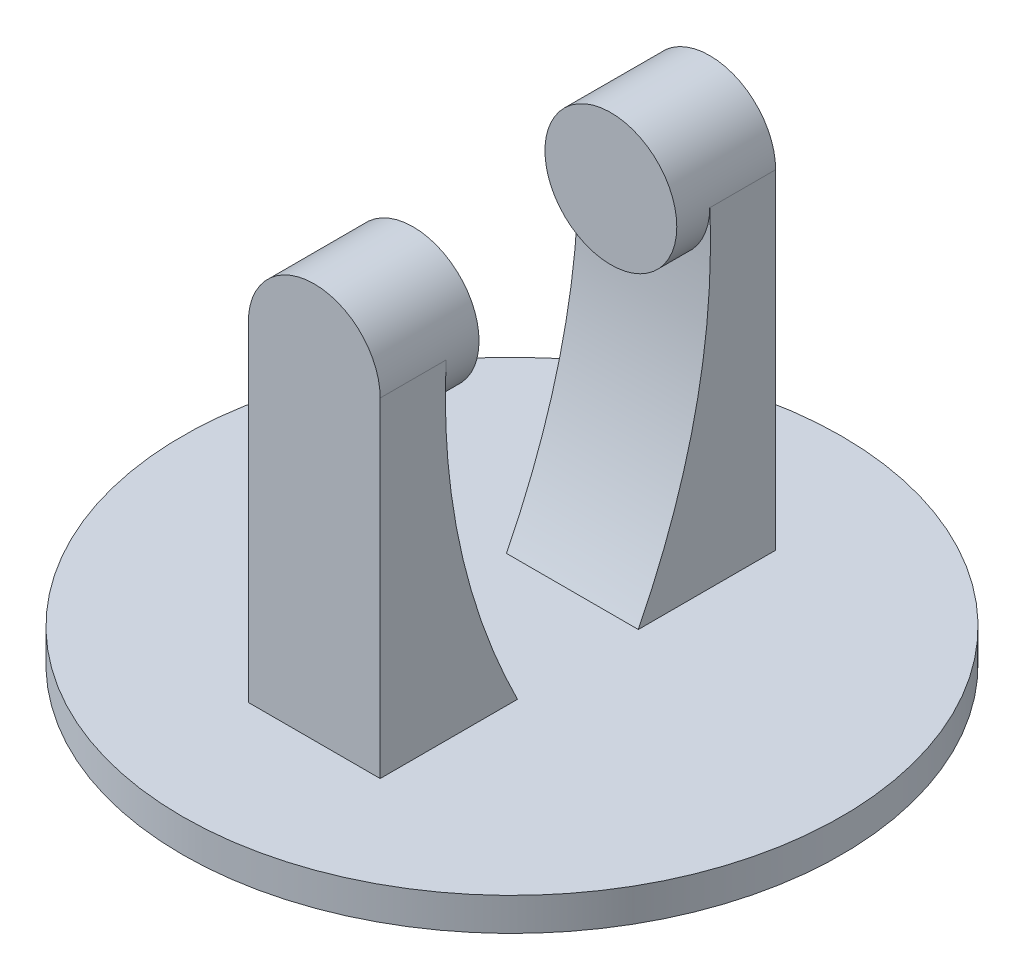
ISO-10303-21;
HEADER;
FILE_DESCRIPTION(('STEP AP214'),'2;1');
FILE_NAME('part.step','',(''),(''),'','','');
FILE_SCHEMA(('AUTOMOTIVE_DESIGN { 1 0 10303 214 1 1 1 1 }'));
ENDSEC;
DATA;
#1=APPLICATION_CONTEXT('core data for automotive mechanical design processes');
#2=APPLICATION_PROTOCOL_DEFINITION('international standard','automotive_design',2000,#1);
#3=PRODUCT_CONTEXT('',#1,'mechanical');
#4=PRODUCT('Part','Part','',(#3));
#5=PRODUCT_RELATED_PRODUCT_CATEGORY('part','',(#4));
#6=PRODUCT_DEFINITION_FORMATION('','',#4);
#7=PRODUCT_DEFINITION_CONTEXT('part definition',#1,'design');
#8=PRODUCT_DEFINITION('design','',#6,#7);
#9=PRODUCT_DEFINITION_SHAPE('','',#8);
#10=(LENGTH_UNIT() NAMED_UNIT(*) SI_UNIT(.MILLI.,.METRE.));
#11=(NAMED_UNIT(*) PLANE_ANGLE_UNIT() SI_UNIT($,.RADIAN.));
#12=(NAMED_UNIT(*) SI_UNIT($,.STERADIAN.) SOLID_ANGLE_UNIT());
#13=UNCERTAINTY_MEASURE_WITH_UNIT(LENGTH_MEASURE(1.E-05),#10,'distance_accuracy_value','');
#14=(GEOMETRIC_REPRESENTATION_CONTEXT(3) GLOBAL_UNCERTAINTY_ASSIGNED_CONTEXT((#13)) GLOBAL_UNIT_ASSIGNED_CONTEXT((#10,
#11,#12)) REPRESENTATION_CONTEXT('',''));
#15=CARTESIAN_POINT('',(0.,0.,0.));
#16=DIRECTION('',(0.,0.,1.));
#17=DIRECTION('',(1.,0.,0.));
#18=AXIS2_PLACEMENT_3D('',#15,#16,#17);
#19=CARTESIAN_POINT('',(71.,5.00000000000001,-9.16621620997291));
#20=CARTESIAN_POINT('',(71.,29.1291286348068,-21.2181294552747));
#21=CARTESIAN_POINT('',(71.,55.,-20.));
#22=B_SPLINE_CURVE_WITH_KNOTS('',2,(#19,#20,#21),.UNSPECIFIED.,.F.,.F.,(3,3),(0.,1.),.UNSPECIFIED.);
#23=DIRECTION('',(-1.,0.,0.));
#24=VECTOR('',#23,1.);
#25=SURFACE_OF_LINEAR_EXTRUSION('',#22,#24);
#26=DIRECTION('',(-1.,0.,0.));
#27=VECTOR('',#26,1.);
#28=CARTESIAN_POINT('',(71.,5.00000000000001,-9.16621620997291));
#29=LINE('',#28,#27);
#30=CARTESIAN_POINT('',(10.,5.,-9.16621620997291));
#31=VERTEX_POINT('',#30);
#32=CARTESIAN_POINT('',(-9.99999999999999,5.00000000000001,-9.16621620997291));
#33=VERTEX_POINT('',#32);
#34=EDGE_CURVE('E143',#31,#33,#29,.T.);
#35=ORIENTED_EDGE('',*,*,#34,.F.);
#36=CARTESIAN_POINT('',(10.,5.00000000000001,-9.16621620997291));
#37=CARTESIAN_POINT('',(10.,29.1291286348068,-21.2181294552747));
#38=CARTESIAN_POINT('',(10.,55.,-20.));
#39=B_SPLINE_CURVE_WITH_KNOTS('',2,(#36,#37,#38),.UNSPECIFIED.,.F.,.F.,(3,3),(0.,1.),.UNSPECIFIED.);
#40=CARTESIAN_POINT('',(10.,55.,-20.));
#41=VERTEX_POINT('',#40);
#42=EDGE_CURVE('E140',#41,#31,#39,.F.);
#43=ORIENTED_EDGE('',*,*,#42,.F.);
#44=DIRECTION('',(-1.,0.,0.));
#45=VECTOR('',#44,1.);
#46=CARTESIAN_POINT('',(71.,55.,-20.));
#47=LINE('',#46,#45);
#48=CARTESIAN_POINT('',(-10.,55.,-20.));
#49=VERTEX_POINT('',#48);
#50=EDGE_CURVE('E126',#41,#49,#47,.T.);
#51=ORIENTED_EDGE('',*,*,#50,.T.);
#52=CARTESIAN_POINT('',(-9.99999999999999,5.00000000000001,-9.16621620997291));
#53=CARTESIAN_POINT('',(-9.99999999999999,29.1291286348068,-21.2181294552747));
#54=CARTESIAN_POINT('',(-9.99999999999999,55.,-20.));
#55=B_SPLINE_CURVE_WITH_KNOTS('',2,(#52,#53,#54),.UNSPECIFIED.,.F.,.F.,(3,3),(0.,1.),.UNSPECIFIED.);
#56=EDGE_CURVE('E137',#33,#49,#55,.T.);
#57=ORIENTED_EDGE('',*,*,#56,.F.);
#58=EDGE_LOOP('',(#35,#43,#51,#57));
#59=FACE_BOUND('',#58,.T.);
#60=DIRECTION('',(-1.,0.,0.));
#61=VECTOR('',#60,1.);
#62=CARTESIAN_POINT('',(0.,45.5593940625961,-20.));
#63=LINE('',#62,#61);
#64=CARTESIAN_POINT('',(-3.29772035422255,45.5593940625961,-20.));
#65=VERTEX_POINT('',#64);
#66=CARTESIAN_POINT('',(3.29772035422255,45.5593940625961,-20.));
#67=VERTEX_POINT('',#66);
#68=EDGE_CURVE('E11',#65,#67,#63,.F.);
#69=ORIENTED_EDGE('',*,*,#68,.T.);
#70=CARTESIAN_POINT('',(3.29772035422244,45.559394062596,-20.));
#71=CARTESIAN_POINT('',(3.02892611762223,45.4654664598282,-19.9955136859434));
#72=CARTESIAN_POINT('',(2.75609427585658,45.3830773511503,-19.9914584820888));
#73=CARTESIAN_POINT('',(2.2044076591064,45.2418505050547,-19.9843733362315));
#74=CARTESIAN_POINT('',(1.92555329109727,45.1830111814635,-19.98134332518));
#75=CARTESIAN_POINT('',(1.37156719804575,45.0906344882697,-19.9765380091939));
#76=CARTESIAN_POINT('',(1.09654425142486,45.0564453042907,-19.9747304662435));
#77=CARTESIAN_POINT('',(0.544615740513268,45.0110035824606,-19.972319843286));
#78=CARTESIAN_POINT('',(0.267710265484324,44.9997499646051,-19.971716706565));
#79=CARTESIAN_POINT('',(-0.284591828833632,45.0002571050911,-19.9717437747347));
#80=CARTESIAN_POINT('',(-0.5599885695491,45.0118946627654,-19.9723673772968));
#81=CARTESIAN_POINT('',(-1.10888647517297,45.0578555624295,-19.9748050178421));
#82=CARTESIAN_POINT('',(-1.38238756798224,45.092179762551,-19.9766191008559));
#83=CARTESIAN_POINT('',(-1.93326503477183,45.1845723993028,-19.981423743917));
#84=CARTESIAN_POINT('',(-2.21053377183331,45.2432820325005,-19.984445984055));
#85=CARTESIAN_POINT('',(-2.75910636570185,45.3839877280837,-19.9915033855504));
#86=CARTESIAN_POINT('',(-3.03040978043423,45.4659855100695,-19.995538621705));
#87=CARTESIAN_POINT('',(-3.29772035422246,45.559394062596,-20.));
#88=B_SPLINE_CURVE_WITH_KNOTS('',3,(#70,#71,#72,#73,#74,#75,#76,#77,#78,#79,#80,#81,#82,#83,#84,
#85,#86,#87),.UNSPECIFIED.,.F.,.F.,(4,2,2,2,2,2,2,2,4),(0.,0.854045129624884,1.70803272616397,
2.53851600667453,3.36896017996676,4.19494711753831,5.02096530019915,5.87023572725006,
6.71956888085777),.UNSPECIFIED.);
#89=EDGE_CURVE('E324',#67,#65,#88,.T.);
#90=ORIENTED_EDGE('',*,*,#89,.T.);
#91=EDGE_LOOP('',(#69,#90));
#92=FACE_BOUND('',#91,.T.);
#93=ADVANCED_FACE('F46',(#59,#92),#25,.T.);
#94=CARTESIAN_POINT('',(71.,55.,20.));
#95=CARTESIAN_POINT('',(71.,29.1291286348069,21.2181294552747));
#96=CARTESIAN_POINT('',(71.,5.00000000000001,9.16621620997289));
#97=B_SPLINE_CURVE_WITH_KNOTS('',2,(#94,#95,#96),.UNSPECIFIED.,.F.,.F.,(3,3),(0.,1.),.UNSPECIFIED.);
#98=DIRECTION('',(-1.,0.,0.));
#99=VECTOR('',#98,1.);
#100=SURFACE_OF_LINEAR_EXTRUSION('',#97,#99);
#101=DIRECTION('',(-1.,0.,0.));
#102=VECTOR('',#101,1.);
#103=CARTESIAN_POINT('',(71.,55.,20.));
#104=LINE('',#103,#102);
#105=CARTESIAN_POINT('',(10.,55.,20.));
#106=VERTEX_POINT('',#105);
#107=CARTESIAN_POINT('',(-10.,55.,20.));
#108=VERTEX_POINT('',#107);
#109=EDGE_CURVE('E157',#106,#108,#104,.T.);
#110=ORIENTED_EDGE('',*,*,#109,.F.);
#111=CARTESIAN_POINT('',(10.,55.,20.));
#112=CARTESIAN_POINT('',(10.,29.1291286348069,21.2181294552747));
#113=CARTESIAN_POINT('',(10.,5.00000000000001,9.16621620997289));
#114=B_SPLINE_CURVE_WITH_KNOTS('',2,(#111,#112,#113),.UNSPECIFIED.,.F.,.F.,(3,3),(0.,1.),.UNSPECIFIED.);
#115=CARTESIAN_POINT('',(10.,5.,9.16621620997289));
#116=VERTEX_POINT('',#115);
#117=EDGE_CURVE('E199',#116,#106,#114,.F.);
#118=ORIENTED_EDGE('',*,*,#117,.F.);
#119=DIRECTION('',(-1.,0.,0.));
#120=VECTOR('',#119,1.);
#121=CARTESIAN_POINT('',(71.,5.,9.16621620997289));
#122=LINE('',#121,#120);
#123=CARTESIAN_POINT('',(-9.99999999999999,5.,9.16621620997289));
#124=VERTEX_POINT('',#123);
#125=EDGE_CURVE('E248',#116,#124,#122,.T.);
#126=ORIENTED_EDGE('',*,*,#125,.T.);
#127=CARTESIAN_POINT('',(-9.99999999999999,55.,20.));
#128=CARTESIAN_POINT('',(-9.99999999999999,29.1291286348069,21.2181294552747));
#129=CARTESIAN_POINT('',(-9.99999999999999,5.00000000000001,9.16621620997289));
#130=B_SPLINE_CURVE_WITH_KNOTS('',2,(#127,#128,#129),.UNSPECIFIED.,.F.,.F.,(3,3),(0.,1.),.UNSPECIFIED.);
#131=EDGE_CURVE('E156',#108,#124,#130,.T.);
#132=ORIENTED_EDGE('',*,*,#131,.F.);
#133=EDGE_LOOP('',(#110,#118,#126,#132));
#134=FACE_BOUND('',#133,.T.);
#135=DIRECTION('',(-1.,0.,0.));
#136=VECTOR('',#135,1.);
#137=CARTESIAN_POINT('',(0.,45.5593940625955,20.));
#138=LINE('',#137,#136);
#139=CARTESIAN_POINT('',(3.297720354221,45.5593940625955,20.));
#140=VERTEX_POINT('',#139);
#141=CARTESIAN_POINT('',(-3.297720354221,45.5593940625955,20.));
#142=VERTEX_POINT('',#141);
#143=EDGE_CURVE('E208',#140,#142,#138,.T.);
#144=ORIENTED_EDGE('',*,*,#143,.T.);
#145=CARTESIAN_POINT('',(-3.29772035422171,45.5593940625958,20.));
#146=CARTESIAN_POINT('',(-3.0289261176215,45.465466459828,19.9955136859434));
#147=CARTESIAN_POINT('',(-2.75609427585584,45.3830773511501,19.9914584820888));
#148=CARTESIAN_POINT('',(-2.20440765910565,45.2418505050545,19.9843733362315));
#149=CARTESIAN_POINT('',(-1.92555329109652,45.1830111814633,19.98134332518));
#150=CARTESIAN_POINT('',(-1.37156719804499,45.0906344882696,19.9765380091939));
#151=CARTESIAN_POINT('',(-1.0965442514241,45.0564453042907,19.9747304662435));
#152=CARTESIAN_POINT('',(-0.544615740512497,45.0110035824606,19.972319843286));
#153=CARTESIAN_POINT('',(-0.267710265483549,44.9997499646051,19.971716706565));
#154=CARTESIAN_POINT('',(0.284591828834287,45.0002571050912,19.9717437747347));
#155=CARTESIAN_POINT('',(0.559988569549632,45.0118946627654,19.9723673772968));
#156=CARTESIAN_POINT('',(1.10888647517325,45.0578555624295,19.9748050178421));
#157=CARTESIAN_POINT('',(1.38238756798241,45.0921797625511,19.9766191008559));
#158=CARTESIAN_POINT('',(1.93326503477174,45.1845723993028,19.981423743917));
#159=CARTESIAN_POINT('',(2.21053377183309,45.2432820325004,19.984445984055));
#160=CARTESIAN_POINT('',(2.75910636570138,45.3839877280836,19.9915033855503));
#161=CARTESIAN_POINT('',(3.03040978043363,45.4659855100693,19.995538621705));
#162=CARTESIAN_POINT('',(3.29772035422175,45.5593940625958,20.));
#163=B_SPLINE_CURVE_WITH_KNOTS('',3,(#145,#146,#147,#148,#149,#150,#151,#152,#153,#154,#155,
#156,#157,#158,#159,#160,#161,#162),.UNSPECIFIED.,.F.,.F.,(4,2,2,2,2,2,2,2,4),(0.,
0.854045129624887,1.70803272616397,2.53851600667453,3.36896017996677,4.19494711753795,
5.02096530019843,5.87023572724894,6.71956888085625),.UNSPECIFIED.);
#164=EDGE_CURVE('E55',#142,#140,#163,.T.);
#165=ORIENTED_EDGE('',*,*,#164,.T.);
#166=EDGE_LOOP('',(#144,#165));
#167=FACE_BOUND('',#166,.T.);
#168=ADVANCED_FACE('F222',(#134,#167),#100,.T.);
#169=CARTESIAN_POINT('',(-9.99999999999999,0.,-120.));
#170=DIRECTION('',(-1.,0.,0.));
#171=DIRECTION('',(0.,-1.,0.));
#172=AXIS2_PLACEMENT_3D('',#169,#170,#171);
#173=PLANE('',#172);
#174=DIRECTION('',(0.,0.,1.));
#175=VECTOR('',#174,1.);
#176=CARTESIAN_POINT('',(-10.,55.,-120.));
#177=LINE('',#176,#175);
#178=CARTESIAN_POINT('',(-10.,55.,30.));
#179=VERTEX_POINT('',#178);
#180=EDGE_CURVE('E164',#108,#179,#177,.T.);
#181=ORIENTED_EDGE('',*,*,#180,.F.);
#182=ORIENTED_EDGE('',*,*,#131,.T.);
#183=DIRECTION('',(0.,0.,1.));
#184=VECTOR('',#183,1.);
#185=CARTESIAN_POINT('',(-9.99999999999999,5.,-120.));
#186=LINE('',#185,#184);
#187=CARTESIAN_POINT('',(-9.99999999999999,5.,30.));
#188=VERTEX_POINT('',#187);
#189=EDGE_CURVE('E176',#124,#188,#186,.T.);
#190=ORIENTED_EDGE('',*,*,#189,.T.);
#191=DIRECTION('',(0.,-1.,0.));
#192=VECTOR('',#191,1.);
#193=CARTESIAN_POINT('',(-9.99999999999999,0.,30.));
#194=LINE('',#193,#192);
#195=EDGE_CURVE('E173',#179,#188,#194,.T.);
#196=ORIENTED_EDGE('',*,*,#195,.F.);
#197=EDGE_LOOP('',(#181,#182,#190,#196));
#198=FACE_BOUND('',#197,.T.);
#199=ADVANCED_FACE('F297',(#198),#173,.T.);
#200=CARTESIAN_POINT('',(-9.99999999999999,5.,-30.));
#201=VERTEX_POINT('',#200);
#202=EDGE_CURVE('E154',#201,#33,#186,.T.);
#203=ORIENTED_EDGE('',*,*,#202,.T.);
#204=ORIENTED_EDGE('',*,*,#56,.T.);
#205=CARTESIAN_POINT('',(-10.,55.,-30.));
#206=VERTEX_POINT('',#205);
#207=EDGE_CURVE('E151',#206,#49,#177,.T.);
#208=ORIENTED_EDGE('',*,*,#207,.F.);
#209=DIRECTION('',(0.,-1.,0.));
#210=VECTOR('',#209,1.);
#211=CARTESIAN_POINT('',(-10.,65.,-30.));
#212=LINE('',#211,#210);
#213=EDGE_CURVE('E169',#206,#201,#212,.T.);
#214=ORIENTED_EDGE('',*,*,#213,.T.);
#215=EDGE_LOOP('',(#203,#204,#208,#214));
#216=FACE_BOUND('',#215,.T.);
#217=ADVANCED_FACE('F149',(#216),#173,.T.);
#218=CARTESIAN_POINT('',(0.,55.,-120.));
#219=DIRECTION('',(0.,0.,1.));
#220=DIRECTION('',(1.,0.,0.));
#221=AXIS2_PLACEMENT_3D('',#218,#219,#220);
#222=CYLINDRICAL_SURFACE('',#221,10.);
#223=DIRECTION('',(0.,0.,1.));
#224=VECTOR('',#223,1.);
#225=CARTESIAN_POINT('',(10.,55.,-120.));
#226=LINE('',#225,#224);
#227=CARTESIAN_POINT('',(10.,55.,30.));
#228=VERTEX_POINT('',#227);
#229=EDGE_CURVE('E270',#106,#228,#226,.T.);
#230=ORIENTED_EDGE('',*,*,#229,.F.);
#231=CARTESIAN_POINT('',(0.,55.,20.));
#232=DIRECTION('',(0.,0.,-1.));
#233=DIRECTION('',(0.,1.,0.));
#234=AXIS2_PLACEMENT_3D('',#231,#232,#233);
#235=CIRCLE('',#234,10.);
#236=EDGE_CURVE('E317',#106,#140,#235,.T.);
#237=ORIENTED_EDGE('',*,*,#236,.T.);
#238=ORIENTED_EDGE('',*,*,#164,.F.);
#239=EDGE_CURVE('E70',#142,#108,#235,.T.);
#240=ORIENTED_EDGE('',*,*,#239,.T.);
#241=ORIENTED_EDGE('',*,*,#180,.T.);
#242=CARTESIAN_POINT('',(0.,55.,30.));
#243=DIRECTION('',(0.,0.,1.));
#244=DIRECTION('',(1.,0.,0.));
#245=AXIS2_PLACEMENT_3D('',#242,#243,#244);
#246=CIRCLE('',#245,10.);
#247=EDGE_CURVE('E282',#228,#179,#246,.T.);
#248=ORIENTED_EDGE('',*,*,#247,.F.);
#249=EDGE_LOOP('',(#230,#237,#238,#240,#241,#248));
#250=FACE_BOUND('',#249,.T.);
#251=CARTESIAN_POINT('',(0.,55.,15.));
#252=DIRECTION('',(0.,0.,-1.));
#253=DIRECTION('',(0.,1.,0.));
#254=AXIS2_PLACEMENT_3D('',#251,#252,#253);
#255=CIRCLE('',#254,10.);
#256=CARTESIAN_POINT('',(0.,65.,15.));
#257=VERTEX_POINT('',#256);
#258=EDGE_CURVE('E144',#257,#257,#255,.T.);
#259=ORIENTED_EDGE('',*,*,#258,.F.);
#260=EDGE_LOOP('',(#259));
#261=FACE_BOUND('',#260,.T.);
#262=ADVANCED_FACE('F313',(#250,#261),#222,.T.);
#263=ORIENTED_EDGE('',*,*,#207,.T.);
#264=CARTESIAN_POINT('',(0.,55.,-20.));
#265=DIRECTION('',(0.,0.,1.));
#266=DIRECTION('',(1.,0.,0.));
#267=AXIS2_PLACEMENT_3D('',#264,#265,#266);
#268=CIRCLE('',#267,10.);
#269=EDGE_CURVE('E123',#49,#65,#268,.T.);
#270=ORIENTED_EDGE('',*,*,#269,.T.);
#271=ORIENTED_EDGE('',*,*,#89,.F.);
#272=EDGE_CURVE('E62',#67,#41,#268,.T.);
#273=ORIENTED_EDGE('',*,*,#272,.T.);
#274=CARTESIAN_POINT('',(10.,55.,-30.));
#275=VERTEX_POINT('',#274);
#276=EDGE_CURVE('E277',#275,#41,#226,.T.);
#277=ORIENTED_EDGE('',*,*,#276,.F.);
#278=CARTESIAN_POINT('',(0.,55.,-30.));
#279=DIRECTION('',(0.,0.,1.));
#280=DIRECTION('',(1.,0.,0.));
#281=AXIS2_PLACEMENT_3D('',#278,#279,#280);
#282=CIRCLE('',#281,10.);
#283=EDGE_CURVE('E162',#275,#206,#282,.T.);
#284=ORIENTED_EDGE('',*,*,#283,.T.);
#285=EDGE_LOOP('',(#263,#270,#271,#273,#277,#284));
#286=FACE_BOUND('',#285,.T.);
#287=CARTESIAN_POINT('',(0.,55.,-15.));
#288=DIRECTION('',(0.,0.,1.));
#289=DIRECTION('',(1.,0.,0.));
#290=AXIS2_PLACEMENT_3D('',#287,#288,#289);
#291=CIRCLE('',#290,10.);
#292=CARTESIAN_POINT('',(10.,55.,-15.));
#293=VERTEX_POINT('',#292);
#294=EDGE_CURVE('E132',#293,#293,#291,.T.);
#295=ORIENTED_EDGE('',*,*,#294,.F.);
#296=EDGE_LOOP('',(#295));
#297=FACE_BOUND('',#296,.T.);
#298=ADVANCED_FACE('F159',(#286,#297),#222,.T.);
#299=CARTESIAN_POINT('',(10.,0.,-120.));
#300=DIRECTION('',(1.,0.,0.));
#301=DIRECTION('',(0.,1.,0.));
#302=AXIS2_PLACEMENT_3D('',#299,#300,#301);
#303=PLANE('',#302);
#304=DIRECTION('',(0.,0.,1.));
#305=VECTOR('',#304,1.);
#306=CARTESIAN_POINT('',(10.,5.,-120.));
#307=LINE('',#306,#305);
#308=CARTESIAN_POINT('',(10.,5.,30.));
#309=VERTEX_POINT('',#308);
#310=EDGE_CURVE('E276',#116,#309,#307,.T.);
#311=ORIENTED_EDGE('',*,*,#310,.F.);
#312=ORIENTED_EDGE('',*,*,#117,.T.);
#313=ORIENTED_EDGE('',*,*,#229,.T.);
#314=DIRECTION('',(0.,1.,0.));
#315=VECTOR('',#314,1.);
#316=CARTESIAN_POINT('',(10.,0.,30.));
#317=LINE('',#316,#315);
#318=EDGE_CURVE('E263',#309,#228,#317,.T.);
#319=ORIENTED_EDGE('',*,*,#318,.F.);
#320=EDGE_LOOP('',(#311,#312,#313,#319));
#321=FACE_BOUND('',#320,.T.);
#322=ADVANCED_FACE('F307',(#321),#303,.T.);
#323=ORIENTED_EDGE('',*,*,#276,.T.);
#324=ORIENTED_EDGE('',*,*,#42,.T.);
#325=CARTESIAN_POINT('',(10.,5.,-30.));
#326=VERTEX_POINT('',#325);
#327=EDGE_CURVE('E271',#326,#31,#307,.T.);
#328=ORIENTED_EDGE('',*,*,#327,.F.);
#329=DIRECTION('',(0.,1.,0.));
#330=VECTOR('',#329,1.);
#331=CARTESIAN_POINT('',(10.,65.,-30.));
#332=LINE('',#331,#330);
#333=EDGE_CURVE('E275',#326,#275,#332,.T.);
#334=ORIENTED_EDGE('',*,*,#333,.T.);
#335=EDGE_LOOP('',(#323,#324,#328,#334));
#336=FACE_BOUND('',#335,.T.);
#337=ADVANCED_FACE('F357',(#336),#303,.T.);
#338=CARTESIAN_POINT('',(-30.,65.,-30.));
#339=DIRECTION('',(0.,0.,1.));
#340=DIRECTION('',(1.,0.,0.));
#341=AXIS2_PLACEMENT_3D('',#338,#339,#340);
#342=PLANE('',#341);
#343=ORIENTED_EDGE('',*,*,#283,.F.);
#344=ORIENTED_EDGE('',*,*,#333,.F.);
#345=DIRECTION('',(-1.,0.,0.));
#346=VECTOR('',#345,1.);
#347=CARTESIAN_POINT('',(-30.,5.,-30.));
#348=LINE('',#347,#346);
#349=EDGE_CURVE('E180',#326,#201,#348,.T.);
#350=ORIENTED_EDGE('',*,*,#349,.T.);
#351=ORIENTED_EDGE('',*,*,#213,.F.);
#352=EDGE_LOOP('',(#343,#344,#350,#351));
#353=FACE_BOUND('',#352,.T.);
#354=ADVANCED_FACE('F354',(#353),#342,.F.);
#355=CARTESIAN_POINT('',(-30.,65.,30.));
#356=DIRECTION('',(0.,0.,-1.));
#357=DIRECTION('',(-1.,0.,0.));
#358=AXIS2_PLACEMENT_3D('',#355,#356,#357);
#359=PLANE('',#358);
#360=ORIENTED_EDGE('',*,*,#318,.T.);
#361=ORIENTED_EDGE('',*,*,#247,.T.);
#362=ORIENTED_EDGE('',*,*,#195,.T.);
#363=DIRECTION('',(1.,0.,0.));
#364=VECTOR('',#363,1.);
#365=CARTESIAN_POINT('',(-30.,5.,30.));
#366=LINE('',#365,#364);
#367=EDGE_CURVE('E183',#188,#309,#366,.T.);
#368=ORIENTED_EDGE('',*,*,#367,.T.);
#369=EDGE_LOOP('',(#360,#361,#362,#368));
#370=FACE_BOUND('',#369,.T.);
#371=ADVANCED_FACE('F305',(#370),#359,.F.);
#372=CARTESIAN_POINT('',(0.,5.,0.));
#373=DIRECTION('',(0.,-1.,0.));
#374=DIRECTION('',(0.,0.,-1.));
#375=AXIS2_PLACEMENT_3D('',#372,#373,#374);
#376=CYLINDRICAL_SURFACE('',#375,50.);
#377=CARTESIAN_POINT('',(0.,5.,0.));
#378=DIRECTION('',(0.,1.,0.));
#379=DIRECTION('',(0.,0.,1.));
#380=AXIS2_PLACEMENT_3D('',#377,#378,#379);
#381=CIRCLE('',#380,50.);
#382=CARTESIAN_POINT('',(0.,5.,50.));
#383=VERTEX_POINT('',#382);
#384=EDGE_CURVE('E188',#383,#383,#381,.T.);
#385=ORIENTED_EDGE('',*,*,#384,.F.);
#386=EDGE_LOOP('',(#385));
#387=FACE_BOUND('',#386,.T.);
#388=CARTESIAN_POINT('',(0.,0.,0.));
#389=DIRECTION('',(0.,1.,0.));
#390=DIRECTION('',(0.,0.,1.));
#391=AXIS2_PLACEMENT_3D('',#388,#389,#390);
#392=CIRCLE('',#391,50.);
#393=CARTESIAN_POINT('',(0.,0.,50.));
#394=VERTEX_POINT('',#393);
#395=EDGE_CURVE('E187',#394,#394,#392,.T.);
#396=ORIENTED_EDGE('',*,*,#395,.T.);
#397=EDGE_LOOP('',(#396));
#398=FACE_BOUND('',#397,.T.);
#399=ADVANCED_FACE('F48',(#387,#398),#376,.T.);
#400=CARTESIAN_POINT('',(0.,5.,0.));
#401=DIRECTION('',(0.,1.,0.));
#402=DIRECTION('',(0.,0.,1.));
#403=AXIS2_PLACEMENT_3D('',#400,#401,#402);
#404=PLANE('',#403);
#405=ORIENTED_EDGE('',*,*,#125,.F.);
#406=ORIENTED_EDGE('',*,*,#310,.T.);
#407=ORIENTED_EDGE('',*,*,#367,.F.);
#408=ORIENTED_EDGE('',*,*,#189,.F.);
#409=EDGE_LOOP('',(#405,#406,#407,#408));
#410=FACE_BOUND('',#409,.T.);
#411=ORIENTED_EDGE('',*,*,#34,.T.);
#412=ORIENTED_EDGE('',*,*,#202,.F.);
#413=ORIENTED_EDGE('',*,*,#349,.F.);
#414=ORIENTED_EDGE('',*,*,#327,.T.);
#415=EDGE_LOOP('',(#411,#412,#413,#414));
#416=FACE_BOUND('',#415,.T.);
#417=ORIENTED_EDGE('',*,*,#384,.T.);
#418=EDGE_LOOP('',(#417));
#419=FACE_BOUND('',#418,.T.);
#420=ADVANCED_FACE('F301',(#410,#416,#419),#404,.T.);
#421=CARTESIAN_POINT('',(0.,0.,0.));
#422=DIRECTION('',(0.,1.,0.));
#423=DIRECTION('',(0.,0.,1.));
#424=AXIS2_PLACEMENT_3D('',#421,#422,#423);
#425=PLANE('',#424);
#426=ORIENTED_EDGE('',*,*,#395,.F.);
#427=EDGE_LOOP('',(#426));
#428=FACE_BOUND('',#427,.T.);
#429=ADVANCED_FACE('F337',(#428),#425,.F.);
#430=CARTESIAN_POINT('',(0.,55.,15.));
#431=DIRECTION('',(0.,0.,-1.));
#432=DIRECTION('',(0.,1.,0.));
#433=AXIS2_PLACEMENT_3D('',#430,#431,#432);
#434=PLANE('',#433);
#435=ORIENTED_EDGE('',*,*,#258,.T.);
#436=EDGE_LOOP('',(#435));
#437=FACE_BOUND('',#436,.T.);
#438=ADVANCED_FACE('F335',(#437),#434,.T.);
#439=CARTESIAN_POINT('',(0.,55.,20.));
#440=DIRECTION('',(0.,0.,-1.));
#441=DIRECTION('',(0.,1.,0.));
#442=AXIS2_PLACEMENT_3D('',#439,#440,#441);
#443=PLANE('',#442);
#444=ORIENTED_EDGE('',*,*,#109,.T.);
#445=ORIENTED_EDGE('',*,*,#239,.F.);
#446=ORIENTED_EDGE('',*,*,#143,.F.);
#447=ORIENTED_EDGE('',*,*,#236,.F.);
#448=EDGE_LOOP('',(#444,#445,#446,#447));
#449=FACE_BOUND('',#448,.T.);
#450=ADVANCED_FACE('F229',(#449),#443,.F.);
#451=CARTESIAN_POINT('',(0.,55.,-15.));
#452=DIRECTION('',(0.,0.,1.));
#453=DIRECTION('',(1.,0.,0.));
#454=AXIS2_PLACEMENT_3D('',#451,#452,#453);
#455=PLANE('',#454);
#456=ORIENTED_EDGE('',*,*,#294,.T.);
#457=EDGE_LOOP('',(#456));
#458=FACE_BOUND('',#457,.T.);
#459=ADVANCED_FACE('F342',(#458),#455,.T.);
#460=CARTESIAN_POINT('',(0.,55.,-20.));
#461=DIRECTION('',(0.,0.,1.));
#462=DIRECTION('',(1.,0.,0.));
#463=AXIS2_PLACEMENT_3D('',#460,#461,#462);
#464=PLANE('',#463);
#465=ORIENTED_EDGE('',*,*,#68,.F.);
#466=ORIENTED_EDGE('',*,*,#269,.F.);
#467=ORIENTED_EDGE('',*,*,#50,.F.);
#468=ORIENTED_EDGE('',*,*,#272,.F.);
#469=EDGE_LOOP('',(#465,#466,#467,#468));
#470=FACE_BOUND('',#469,.T.);
#471=ADVANCED_FACE('F125',(#470),#464,.F.);
#472=CLOSED_SHELL('',(#93,#168,#199,#217,#262,#298,#322,#337,#354,#371,#399,#420,#429,#438,#450,
#459,#471));
#473=MANIFOLD_SOLID_BREP('B2',#472);
#474=ADVANCED_BREP_SHAPE_REPRESENTATION('',(#18,#473),#14);
#475=SHAPE_DEFINITION_REPRESENTATION(#9,#474);
ENDSEC;
END-ISO-10303-21;
